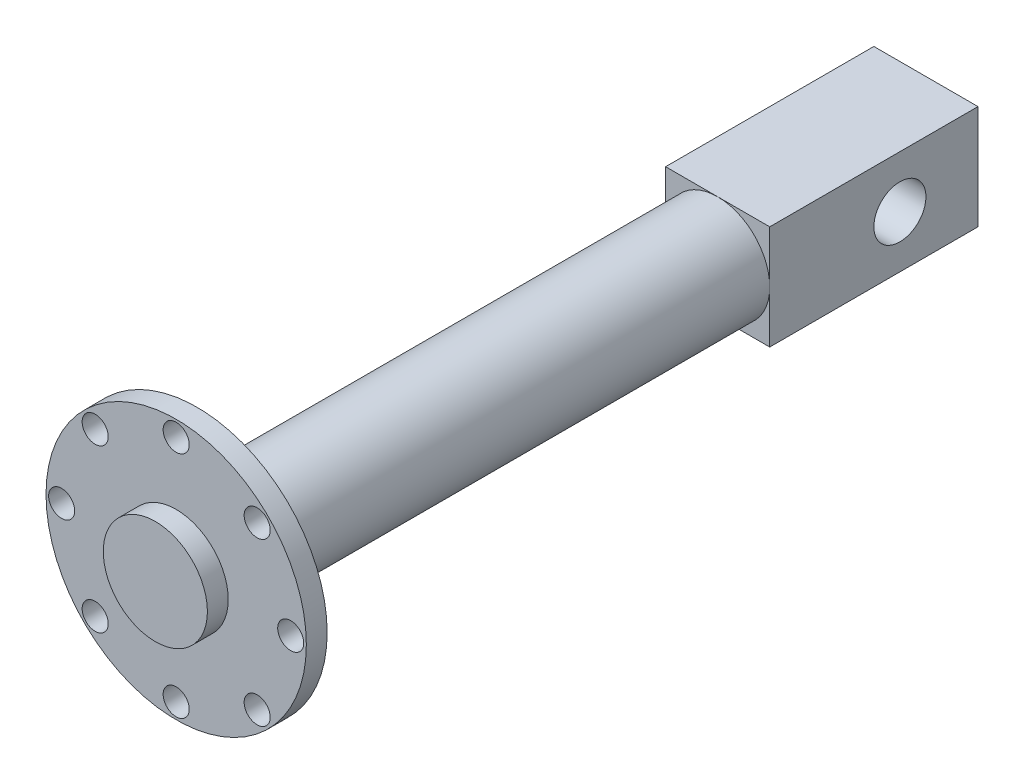
ISO-10303-21;
HEADER;
FILE_DESCRIPTION(('STEP AP214'),'2;1');
FILE_NAME('part.step','',(''),(''),'','','');
FILE_SCHEMA(('AUTOMOTIVE_DESIGN { 1 0 10303 214 1 1 1 1 }'));
ENDSEC;
DATA;
#1=APPLICATION_CONTEXT('core data for automotive mechanical design processes');
#2=APPLICATION_PROTOCOL_DEFINITION('international standard','automotive_design',2000,#1);
#3=PRODUCT_CONTEXT('',#1,'mechanical');
#4=PRODUCT('Part','Part','',(#3));
#5=PRODUCT_RELATED_PRODUCT_CATEGORY('part','',(#4));
#6=PRODUCT_DEFINITION_FORMATION('','',#4);
#7=PRODUCT_DEFINITION_CONTEXT('part definition',#1,'design');
#8=PRODUCT_DEFINITION('design','',#6,#7);
#9=PRODUCT_DEFINITION_SHAPE('','',#8);
#10=(LENGTH_UNIT() NAMED_UNIT(*) SI_UNIT(.MILLI.,.METRE.));
#11=(NAMED_UNIT(*) PLANE_ANGLE_UNIT() SI_UNIT($,.RADIAN.));
#12=(NAMED_UNIT(*) SI_UNIT($,.STERADIAN.) SOLID_ANGLE_UNIT());
#13=UNCERTAINTY_MEASURE_WITH_UNIT(LENGTH_MEASURE(1.E-05),#10,'distance_accuracy_value','');
#14=(GEOMETRIC_REPRESENTATION_CONTEXT(3) GLOBAL_UNCERTAINTY_ASSIGNED_CONTEXT((#13)) GLOBAL_UNIT_ASSIGNED_CONTEXT((#10,
#11,#12)) REPRESENTATION_CONTEXT('',''));
#15=CARTESIAN_POINT('',(0.,0.,0.));
#16=DIRECTION('',(0.,0.,1.));
#17=DIRECTION('',(1.,0.,0.));
#18=AXIS2_PLACEMENT_3D('',#15,#16,#17);
#19=CARTESIAN_POINT('',(0.,0.,20.));
#20=DIRECTION('',(0.,0.,1.));
#21=DIRECTION('',(1.,0.,0.));
#22=AXIS2_PLACEMENT_3D('',#19,#20,#21);
#23=PLANE('',#22);
#24=CARTESIAN_POINT('',(0.,0.,20.));
#25=DIRECTION('',(0.,0.,1.));
#26=DIRECTION('',(1.,0.,0.));
#27=AXIS2_PLACEMENT_3D('',#24,#25,#26);
#28=CIRCLE('',#27,5.);
#29=CARTESIAN_POINT('',(5.,0.,20.));
#30=VERTEX_POINT('',#29);
#31=CARTESIAN_POINT('',(0.,5.,20.));
#32=VERTEX_POINT('',#31);
#33=EDGE_CURVE('E51',#30,#32,#28,.T.);
#34=ORIENTED_EDGE('',*,*,#33,.F.);
#35=DIRECTION('',(0.,1.,0.));
#36=VECTOR('',#35,1.);
#37=CARTESIAN_POINT('',(5.,5.,20.));
#38=LINE('',#37,#36);
#39=CARTESIAN_POINT('',(5.,5.,20.));
#40=VERTEX_POINT('',#39);
#41=EDGE_CURVE('E103',#30,#40,#38,.T.);
#42=ORIENTED_EDGE('',*,*,#41,.T.);
#43=DIRECTION('',(-1.,0.,0.));
#44=VECTOR('',#43,1.);
#45=CARTESIAN_POINT('',(-5.,5.,20.));
#46=LINE('',#45,#44);
#47=EDGE_CURVE('E116',#40,#32,#46,.T.);
#48=ORIENTED_EDGE('',*,*,#47,.T.);
#49=EDGE_LOOP('',(#34,#42,#48));
#50=FACE_BOUND('',#49,.T.);
#51=ADVANCED_FACE('F39',(#50),#23,.T.);
#52=CARTESIAN_POINT('',(-5.,0.,20.));
#53=VERTEX_POINT('',#52);
#54=EDGE_CURVE('E11',#32,#53,#28,.T.);
#55=ORIENTED_EDGE('',*,*,#54,.F.);
#56=CARTESIAN_POINT('',(-5.,5.,20.));
#57=VERTEX_POINT('',#56);
#58=EDGE_CURVE('E102',#32,#57,#46,.T.);
#59=ORIENTED_EDGE('',*,*,#58,.T.);
#60=DIRECTION('',(0.,-1.,0.));
#61=VECTOR('',#60,1.);
#62=CARTESIAN_POINT('',(-5.,5.,20.));
#63=LINE('',#62,#61);
#64=EDGE_CURVE('E138',#57,#53,#63,.T.);
#65=ORIENTED_EDGE('',*,*,#64,.T.);
#66=EDGE_LOOP('',(#55,#59,#65));
#67=FACE_BOUND('',#66,.T.);
#68=ADVANCED_FACE('F294',(#67),#23,.T.);
#69=CARTESIAN_POINT('',(0.,-5.,20.));
#70=VERTEX_POINT('',#69);
#71=EDGE_CURVE('E49',#53,#70,#28,.T.);
#72=ORIENTED_EDGE('',*,*,#71,.F.);
#73=CARTESIAN_POINT('',(-5.,-5.,20.));
#74=VERTEX_POINT('',#73);
#75=EDGE_CURVE('E137',#53,#74,#63,.T.);
#76=ORIENTED_EDGE('',*,*,#75,.T.);
#77=DIRECTION('',(1.,0.,0.));
#78=VECTOR('',#77,1.);
#79=CARTESIAN_POINT('',(-5.,-5.,20.));
#80=LINE('',#79,#78);
#81=EDGE_CURVE('E142',#74,#70,#80,.T.);
#82=ORIENTED_EDGE('',*,*,#81,.T.);
#83=EDGE_LOOP('',(#72,#76,#82));
#84=FACE_BOUND('',#83,.T.);
#85=ADVANCED_FACE('F299',(#84),#23,.T.);
#86=CARTESIAN_POINT('',(5.,5.,20.));
#87=DIRECTION('',(-1.,0.,0.));
#88=DIRECTION('',(0.,-1.,0.));
#89=AXIS2_PLACEMENT_3D('',#86,#87,#88);
#90=PLANE('',#89);
#91=CARTESIAN_POINT('',(5.,0.,7.5));
#92=DIRECTION('',(1.,0.,0.));
#93=DIRECTION('',(0.,1.,0.));
#94=AXIS2_PLACEMENT_3D('',#91,#92,#93);
#95=CIRCLE('',#94,2.5);
#96=CARTESIAN_POINT('',(5.,2.5,7.5));
#97=VERTEX_POINT('',#96);
#98=EDGE_CURVE('E130',#97,#97,#95,.T.);
#99=ORIENTED_EDGE('',*,*,#98,.F.);
#100=EDGE_LOOP('',(#99));
#101=FACE_BOUND('',#100,.T.);
#102=DIRECTION('',(0.,1.,0.));
#103=VECTOR('',#102,1.);
#104=CARTESIAN_POINT('',(5.,5.,0.));
#105=LINE('',#104,#103);
#106=CARTESIAN_POINT('',(5.,-5.,0.));
#107=VERTEX_POINT('',#106);
#108=CARTESIAN_POINT('',(5.,5.,0.));
#109=VERTEX_POINT('',#108);
#110=EDGE_CURVE('E146',#107,#109,#105,.T.);
#111=ORIENTED_EDGE('',*,*,#110,.T.);
#112=DIRECTION('',(0.,0.,-1.));
#113=VECTOR('',#112,1.);
#114=CARTESIAN_POINT('',(5.,5.,20.));
#115=LINE('',#114,#113);
#116=EDGE_CURVE('E109',#40,#109,#115,.T.);
#117=ORIENTED_EDGE('',*,*,#116,.F.);
#118=ORIENTED_EDGE('',*,*,#41,.F.);
#119=CARTESIAN_POINT('',(5.,-5.,20.));
#120=VERTEX_POINT('',#119);
#121=EDGE_CURVE('E94',#120,#30,#38,.T.);
#122=ORIENTED_EDGE('',*,*,#121,.F.);
#123=DIRECTION('',(0.,0.,-1.));
#124=VECTOR('',#123,1.);
#125=CARTESIAN_POINT('',(5.,-5.,20.));
#126=LINE('',#125,#124);
#127=EDGE_CURVE('E145',#120,#107,#126,.T.);
#128=ORIENTED_EDGE('',*,*,#127,.T.);
#129=EDGE_LOOP('',(#111,#117,#118,#122,#128));
#130=FACE_BOUND('',#129,.T.);
#131=ADVANCED_FACE('F41',(#101,#130),#90,.F.);
#132=CARTESIAN_POINT('',(-5.,5.,20.));
#133=DIRECTION('',(0.,-1.,0.));
#134=DIRECTION('',(0.,0.,-1.));
#135=AXIS2_PLACEMENT_3D('',#132,#133,#134);
#136=PLANE('',#135);
#137=DIRECTION('',(-1.,0.,0.));
#138=VECTOR('',#137,1.);
#139=CARTESIAN_POINT('',(-5.,5.,0.));
#140=LINE('',#139,#138);
#141=CARTESIAN_POINT('',(-5.,5.,0.));
#142=VERTEX_POINT('',#141);
#143=EDGE_CURVE('E149',#109,#142,#140,.T.);
#144=ORIENTED_EDGE('',*,*,#143,.T.);
#145=DIRECTION('',(0.,0.,-1.));
#146=VECTOR('',#145,1.);
#147=CARTESIAN_POINT('',(-5.,5.,20.));
#148=LINE('',#147,#146);
#149=EDGE_CURVE('E125',#57,#142,#148,.T.);
#150=ORIENTED_EDGE('',*,*,#149,.F.);
#151=ORIENTED_EDGE('',*,*,#58,.F.);
#152=ORIENTED_EDGE('',*,*,#47,.F.);
#153=ORIENTED_EDGE('',*,*,#116,.T.);
#154=EDGE_LOOP('',(#144,#150,#151,#152,#153));
#155=FACE_BOUND('',#154,.T.);
#156=ADVANCED_FACE('F318',(#155),#136,.F.);
#157=CARTESIAN_POINT('',(-5.,5.,20.));
#158=DIRECTION('',(1.,0.,0.));
#159=DIRECTION('',(0.,0.,-1.));
#160=AXIS2_PLACEMENT_3D('',#157,#158,#159);
#161=PLANE('',#160);
#162=CARTESIAN_POINT('',(-5.,0.,7.5));
#163=DIRECTION('',(1.,0.,0.));
#164=DIRECTION('',(0.,0.,-1.));
#165=AXIS2_PLACEMENT_3D('',#162,#163,#164);
#166=CIRCLE('',#165,2.5);
#167=CARTESIAN_POINT('',(-5.,2.5,7.5));
#168=VERTEX_POINT('',#167);
#169=EDGE_CURVE('E133',#168,#168,#166,.T.);
#170=ORIENTED_EDGE('',*,*,#169,.T.);
#171=EDGE_LOOP('',(#170));
#172=FACE_BOUND('',#171,.T.);
#173=DIRECTION('',(0.,-1.,0.));
#174=VECTOR('',#173,1.);
#175=CARTESIAN_POINT('',(-5.,5.,0.));
#176=LINE('',#175,#174);
#177=CARTESIAN_POINT('',(-5.,-5.,0.));
#178=VERTEX_POINT('',#177);
#179=EDGE_CURVE('E152',#142,#178,#176,.T.);
#180=ORIENTED_EDGE('',*,*,#179,.T.);
#181=DIRECTION('',(0.,0.,-1.));
#182=VECTOR('',#181,1.);
#183=CARTESIAN_POINT('',(-5.,-5.,20.));
#184=LINE('',#183,#182);
#185=EDGE_CURVE('E159',#74,#178,#184,.T.);
#186=ORIENTED_EDGE('',*,*,#185,.F.);
#187=ORIENTED_EDGE('',*,*,#75,.F.);
#188=ORIENTED_EDGE('',*,*,#64,.F.);
#189=ORIENTED_EDGE('',*,*,#149,.T.);
#190=EDGE_LOOP('',(#180,#186,#187,#188,#189));
#191=FACE_BOUND('',#190,.T.);
#192=ADVANCED_FACE('F311',(#172,#191),#161,.F.);
#193=CARTESIAN_POINT('',(-5.,-5.,20.));
#194=DIRECTION('',(0.,1.,0.));
#195=DIRECTION('',(0.,0.,1.));
#196=AXIS2_PLACEMENT_3D('',#193,#194,#195);
#197=PLANE('',#196);
#198=DIRECTION('',(1.,0.,0.));
#199=VECTOR('',#198,1.);
#200=CARTESIAN_POINT('',(-5.,-5.,0.));
#201=LINE('',#200,#199);
#202=EDGE_CURVE('E114',#178,#107,#201,.T.);
#203=ORIENTED_EDGE('',*,*,#202,.T.);
#204=ORIENTED_EDGE('',*,*,#127,.F.);
#205=EDGE_CURVE('E97',#70,#120,#80,.T.);
#206=ORIENTED_EDGE('',*,*,#205,.F.);
#207=ORIENTED_EDGE('',*,*,#81,.F.);
#208=ORIENTED_EDGE('',*,*,#185,.T.);
#209=EDGE_LOOP('',(#203,#204,#206,#207,#208));
#210=FACE_BOUND('',#209,.T.);
#211=ADVANCED_FACE('F305',(#210),#197,.F.);
#212=EDGE_CURVE('E58',#70,#30,#28,.T.);
#213=ORIENTED_EDGE('',*,*,#212,.F.);
#214=ORIENTED_EDGE('',*,*,#205,.T.);
#215=ORIENTED_EDGE('',*,*,#121,.T.);
#216=EDGE_LOOP('',(#213,#214,#215));
#217=FACE_BOUND('',#216,.T.);
#218=ADVANCED_FACE('F96',(#217),#23,.T.);
#219=CARTESIAN_POINT('',(0.,0.,0.));
#220=DIRECTION('',(0.,0.,1.));
#221=DIRECTION('',(1.,0.,0.));
#222=AXIS2_PLACEMENT_3D('',#219,#220,#221);
#223=PLANE('',#222);
#224=ORIENTED_EDGE('',*,*,#110,.F.);
#225=ORIENTED_EDGE('',*,*,#202,.F.);
#226=ORIENTED_EDGE('',*,*,#179,.F.);
#227=ORIENTED_EDGE('',*,*,#143,.F.);
#228=EDGE_LOOP('',(#224,#225,#226,#227));
#229=FACE_BOUND('',#228,.T.);
#230=ADVANCED_FACE('F304',(#229),#223,.F.);
#231=CARTESIAN_POINT('',(-15.,0.,7.5));
#232=DIRECTION('',(1.,0.,0.));
#233=DIRECTION('',(0.,1.,0.));
#234=AXIS2_PLACEMENT_3D('',#231,#232,#233);
#235=CYLINDRICAL_SURFACE('',#234,2.5);
#236=CARTESIAN_POINT('',(5.,2.5,7.5));
#237=CARTESIAN_POINT('',(4.89583333333333,2.5,7.5));
#238=CARTESIAN_POINT('',(4.79166666666667,2.5,7.5));
#239=CARTESIAN_POINT('',(4.58333333333333,2.5,7.5));
#240=CARTESIAN_POINT('',(4.47916666666667,2.5,7.5));
#241=CARTESIAN_POINT('',(4.27083333333333,2.5,7.5));
#242=CARTESIAN_POINT('',(4.16666666666667,2.5,7.5));
#243=CARTESIAN_POINT('',(3.95833333333333,2.5,7.5));
#244=CARTESIAN_POINT('',(3.85416666666667,2.5,7.5));
#245=CARTESIAN_POINT('',(3.64583333333333,2.5,7.5));
#246=CARTESIAN_POINT('',(3.54166666666667,2.5,7.5));
#247=CARTESIAN_POINT('',(3.33333333333333,2.5,7.5));
#248=CARTESIAN_POINT('',(3.22916666666667,2.5,7.5));
#249=CARTESIAN_POINT('',(3.02083333333333,2.5,7.5));
#250=CARTESIAN_POINT('',(2.91666666666667,2.5,7.5));
#251=CARTESIAN_POINT('',(2.70833333333333,2.5,7.5));
#252=CARTESIAN_POINT('',(2.60416666666667,2.5,7.5));
#253=CARTESIAN_POINT('',(2.39583333333333,2.5,7.5));
#254=CARTESIAN_POINT('',(2.29166666666667,2.5,7.5));
#255=CARTESIAN_POINT('',(2.08333333333333,2.5,7.5));
#256=CARTESIAN_POINT('',(1.97916666666667,2.5,7.5));
#257=CARTESIAN_POINT('',(1.77083333333333,2.5,7.5));
#258=CARTESIAN_POINT('',(1.66666666666666,2.5,7.5));
#259=CARTESIAN_POINT('',(1.45833333333333,2.5,7.5));
#260=CARTESIAN_POINT('',(1.35416666666666,2.5,7.5));
#261=CARTESIAN_POINT('',(1.14583333333333,2.5,7.5));
#262=CARTESIAN_POINT('',(1.04166666666666,2.5,7.5));
#263=CARTESIAN_POINT('',(0.833333333333331,2.5,7.5));
#264=CARTESIAN_POINT('',(0.729166666666664,2.5,7.5));
#265=CARTESIAN_POINT('',(0.520833333333331,2.5,7.5));
#266=CARTESIAN_POINT('',(0.416666666666666,2.5,7.5));
#267=CARTESIAN_POINT('',(0.208333333333334,2.5,7.5));
#268=CARTESIAN_POINT('',(0.104166666666667,2.5,7.5));
#269=CARTESIAN_POINT('',(-0.104166666666667,2.5,7.5));
#270=CARTESIAN_POINT('',(-0.208333333333334,2.5,7.5));
#271=CARTESIAN_POINT('',(-0.416666666666667,2.5,7.5));
#272=CARTESIAN_POINT('',(-0.520833333333334,2.5,7.5));
#273=CARTESIAN_POINT('',(-0.729166666666667,2.5,7.5));
#274=CARTESIAN_POINT('',(-0.833333333333334,2.5,7.5));
#275=CARTESIAN_POINT('',(-1.04166666666667,2.5,7.5));
#276=CARTESIAN_POINT('',(-1.14583333333333,2.5,7.5));
#277=CARTESIAN_POINT('',(-1.35416666666667,2.5,7.5));
#278=CARTESIAN_POINT('',(-1.45833333333333,2.5,7.5));
#279=CARTESIAN_POINT('',(-1.66666666666667,2.5,7.5));
#280=CARTESIAN_POINT('',(-1.77083333333333,2.5,7.5));
#281=CARTESIAN_POINT('',(-1.97916666666667,2.5,7.5));
#282=CARTESIAN_POINT('',(-2.08333333333333,2.5,7.5));
#283=CARTESIAN_POINT('',(-2.29166666666667,2.5,7.5));
#284=CARTESIAN_POINT('',(-2.39583333333333,2.5,7.5));
#285=CARTESIAN_POINT('',(-2.60416666666667,2.5,7.5));
#286=CARTESIAN_POINT('',(-2.70833333333333,2.5,7.5));
#287=CARTESIAN_POINT('',(-2.91666666666667,2.5,7.5));
#288=CARTESIAN_POINT('',(-3.02083333333333,2.5,7.5));
#289=CARTESIAN_POINT('',(-3.22916666666667,2.5,7.5));
#290=CARTESIAN_POINT('',(-3.33333333333333,2.5,7.5));
#291=CARTESIAN_POINT('',(-3.54166666666667,2.5,7.5));
#292=CARTESIAN_POINT('',(-3.64583333333333,2.5,7.5));
#293=CARTESIAN_POINT('',(-3.85416666666667,2.5,7.5));
#294=CARTESIAN_POINT('',(-3.95833333333334,2.5,7.5));
#295=CARTESIAN_POINT('',(-4.16666666666667,2.5,7.5));
#296=CARTESIAN_POINT('',(-4.27083333333334,2.5,7.5));
#297=CARTESIAN_POINT('',(-4.47916666666667,2.5,7.5));
#298=CARTESIAN_POINT('',(-4.58333333333334,2.5,7.5));
#299=CARTESIAN_POINT('',(-4.79166666666667,2.5,7.5));
#300=CARTESIAN_POINT('',(-4.89583333333334,2.5,7.5));
#301=CARTESIAN_POINT('',(-5.,2.5,7.5));
#302=B_SPLINE_CURVE_WITH_KNOTS('',3,(#236,#237,#238,#239,#240,#241,#242,#243,#244,#245,#246,
#247,#248,#249,#250,#251,#252,#253,#254,#255,#256,#257,#258,#259,#260,#261,#262,#263,#264,#265,
#266,#267,#268,#269,#270,#271,#272,#273,#274,#275,#276,#277,#278,#279,#280,#281,#282,#283,#284,
#285,#286,#287,#288,#289,#290,#291,#292,#293,#294,#295,#296,#297,#298,#299,#300,#301),
.UNSPECIFIED.,.F.,.F.,(4,2,2,2,2,2,2,2,2,2,2,2,2,2,2,2,2,2,2,2,2,2,2,2,2,2,2,2,2,2,2,2,4),(0.,
0.3125,0.625000000000001,0.937500000000001,1.25,1.5625,1.875,2.1875,2.5,2.8125,3.125,3.4375,
3.75,4.0625,4.375,4.6875,5.,5.3125,5.625,5.9375,6.25,6.5625,6.875,7.1875,7.5,7.8125,8.125,
8.4375,8.75,9.0625,9.375,9.6875,10.),.UNSPECIFIED.);
#303=EDGE_CURVE('BSEAM289',#97,#168,#302,.T.);
#304=ORIENTED_EDGE('',*,*,#98,.T.);
#305=ORIENTED_EDGE('',*,*,#169,.F.);
#306=ORIENTED_EDGE('',*,*,#303,.T.);
#307=ORIENTED_EDGE('',*,*,#303,.F.);
#308=EDGE_LOOP('',(#304,#306,#305,#307));
#309=FACE_BOUND('',#308,.T.);
#310=ADVANCED_FACE('F289',(#309),#235,.F.);
#311=CARTESIAN_POINT('',(0.,0.,70.));
#312=DIRECTION('',(0.,0.,-1.));
#313=DIRECTION('',(-1.,0.,0.));
#314=AXIS2_PLACEMENT_3D('',#311,#312,#313);
#315=CYLINDRICAL_SURFACE('',#314,5.);
#316=CARTESIAN_POINT('',(0.,0.,70.));
#317=DIRECTION('',(0.,0.,1.));
#318=DIRECTION('',(1.,0.,0.));
#319=AXIS2_PLACEMENT_3D('',#316,#317,#318);
#320=CIRCLE('',#319,5.);
#321=CARTESIAN_POINT('',(5.,0.,70.));
#322=VERTEX_POINT('',#321);
#323=EDGE_CURVE('E119',#322,#322,#320,.T.);
#324=ORIENTED_EDGE('',*,*,#323,.F.);
#325=EDGE_LOOP('',(#324));
#326=FACE_BOUND('',#325,.T.);
#327=ORIENTED_EDGE('',*,*,#33,.T.);
#328=ORIENTED_EDGE('',*,*,#54,.T.);
#329=ORIENTED_EDGE('',*,*,#71,.T.);
#330=ORIENTED_EDGE('',*,*,#212,.T.);
#331=EDGE_LOOP('',(#327,#328,#329,#330));
#332=FACE_BOUND('',#331,.T.);
#333=ADVANCED_FACE('F121',(#326,#332),#315,.T.);
#334=CARTESIAN_POINT('',(0.,0.,72.));
#335=DIRECTION('',(0.,0.,-1.));
#336=DIRECTION('',(-1.,0.,0.));
#337=AXIS2_PLACEMENT_3D('',#334,#335,#336);
#338=CYLINDRICAL_SURFACE('',#337,12.5);
#339=CARTESIAN_POINT('',(0.,0.,72.));
#340=DIRECTION('',(0.,0.,1.));
#341=DIRECTION('',(1.,0.,0.));
#342=AXIS2_PLACEMENT_3D('',#339,#340,#341);
#343=CIRCLE('',#342,12.5);
#344=CARTESIAN_POINT('',(12.5,0.,72.));
#345=VERTEX_POINT('',#344);
#346=EDGE_CURVE('E120',#345,#345,#343,.T.);
#347=ORIENTED_EDGE('',*,*,#346,.F.);
#348=EDGE_LOOP('',(#347));
#349=FACE_BOUND('',#348,.T.);
#350=CARTESIAN_POINT('',(0.,0.,70.));
#351=DIRECTION('',(0.,0.,1.));
#352=DIRECTION('',(1.,0.,0.));
#353=AXIS2_PLACEMENT_3D('',#350,#351,#352);
#354=CIRCLE('',#353,12.5);
#355=CARTESIAN_POINT('',(12.5,0.,70.));
#356=VERTEX_POINT('',#355);
#357=EDGE_CURVE('E200',#356,#356,#354,.T.);
#358=ORIENTED_EDGE('',*,*,#357,.T.);
#359=EDGE_LOOP('',(#358));
#360=FACE_BOUND('',#359,.T.);
#361=ADVANCED_FACE('F264',(#349,#360),#338,.T.);
#362=CARTESIAN_POINT('',(0.,0.,72.));
#363=DIRECTION('',(0.,0.,1.));
#364=DIRECTION('',(1.,0.,0.));
#365=AXIS2_PLACEMENT_3D('',#362,#363,#364);
#366=PLANE('',#365);
#367=CARTESIAN_POINT('',(0.,0.,72.));
#368=DIRECTION('',(0.,0.,1.));
#369=DIRECTION('',(1.,0.,0.));
#370=AXIS2_PLACEMENT_3D('',#367,#368,#369);
#371=CIRCLE('',#370,5.);
#372=CARTESIAN_POINT('',(5.,0.,72.));
#373=VERTEX_POINT('',#372);
#374=EDGE_CURVE('E243',#373,#373,#371,.T.);
#375=ORIENTED_EDGE('',*,*,#374,.F.);
#376=EDGE_LOOP('',(#375));
#377=FACE_BOUND('',#376,.T.);
#378=CARTESIAN_POINT('',(0.,11.,72.));
#379=DIRECTION('',(0.,0.,1.));
#380=DIRECTION('',(1.,0.,0.));
#381=AXIS2_PLACEMENT_3D('',#378,#379,#380);
#382=CIRCLE('',#381,1.25);
#383=CARTESIAN_POINT('',(1.25,11.,72.));
#384=VERTEX_POINT('',#383);
#385=EDGE_CURVE('E174',#384,#384,#382,.T.);
#386=ORIENTED_EDGE('',*,*,#385,.F.);
#387=EDGE_LOOP('',(#386));
#388=FACE_BOUND('',#387,.T.);
#389=CARTESIAN_POINT('',(7.77817459305216,7.77817459305236,72.));
#390=DIRECTION('',(0.,0.,1.));
#391=DIRECTION('',(1.,0.,0.));
#392=AXIS2_PLACEMENT_3D('',#389,#390,#391);
#393=CIRCLE('',#392,1.25);
#394=CARTESIAN_POINT('',(9.02817459305216,7.77817459305236,72.));
#395=VERTEX_POINT('',#394);
#396=EDGE_CURVE('E236',#395,#395,#393,.T.);
#397=ORIENTED_EDGE('',*,*,#396,.F.);
#398=EDGE_LOOP('',(#397));
#399=FACE_BOUND('',#398,.T.);
#400=CARTESIAN_POINT('',(11.0000000000005,4.78223310904037E-13,72.));
#401=DIRECTION('',(0.,0.,1.));
#402=DIRECTION('',(1.,0.,0.));
#403=AXIS2_PLACEMENT_3D('',#400,#401,#402);
#404=CIRCLE('',#403,1.25);
#405=CARTESIAN_POINT('',(12.2500000000005,4.78223310904037E-13,72.));
#406=VERTEX_POINT('',#405);
#407=EDGE_CURVE('E232',#406,#406,#404,.T.);
#408=ORIENTED_EDGE('',*,*,#407,.F.);
#409=EDGE_LOOP('',(#408));
#410=FACE_BOUND('',#409,.T.);
#411=CARTESIAN_POINT('',(7.77817459305284,-7.77817459305169,72.));
#412=DIRECTION('',(0.,0.,1.));
#413=DIRECTION('',(1.,0.,0.));
#414=AXIS2_PLACEMENT_3D('',#411,#412,#413);
#415=CIRCLE('',#414,1.25);
#416=CARTESIAN_POINT('',(9.02817459305284,-7.77817459305169,72.));
#417=VERTEX_POINT('',#416);
#418=EDGE_CURVE('E228',#417,#417,#415,.T.);
#419=ORIENTED_EDGE('',*,*,#418,.F.);
#420=EDGE_LOOP('',(#419));
#421=FACE_BOUND('',#420,.T.);
#422=CARTESIAN_POINT('',(9.56446621808075E-13,-11.,72.));
#423=DIRECTION('',(0.,0.,1.));
#424=DIRECTION('',(1.,0.,0.));
#425=AXIS2_PLACEMENT_3D('',#422,#423,#424);
#426=CIRCLE('',#425,1.25);
#427=CARTESIAN_POINT('',(1.25000000000096,-11.,72.));
#428=VERTEX_POINT('',#427);
#429=EDGE_CURVE('E224',#428,#428,#426,.T.);
#430=ORIENTED_EDGE('',*,*,#429,.F.);
#431=EDGE_LOOP('',(#430));
#432=FACE_BOUND('',#431,.T.);
#433=CARTESIAN_POINT('',(-7.77817459305121,-7.77817459305236,72.));
#434=DIRECTION('',(0.,0.,1.));
#435=DIRECTION('',(1.,0.,0.));
#436=AXIS2_PLACEMENT_3D('',#433,#434,#435);
#437=CIRCLE('',#436,1.25);
#438=CARTESIAN_POINT('',(-6.52817459305121,-7.77817459305236,72.));
#439=VERTEX_POINT('',#438);
#440=EDGE_CURVE('E220',#439,#439,#437,.T.);
#441=ORIENTED_EDGE('',*,*,#440,.F.);
#442=EDGE_LOOP('',(#441));
#443=FACE_BOUND('',#442,.T.);
#444=CARTESIAN_POINT('',(-10.9999999999995,-4.795704223831E-13,72.));
#445=DIRECTION('',(0.,0.,1.));
#446=DIRECTION('',(1.,0.,0.));
#447=AXIS2_PLACEMENT_3D('',#444,#445,#446);
#448=CIRCLE('',#447,1.25);
#449=CARTESIAN_POINT('',(-9.74999999999952,-4.795704223831E-13,72.));
#450=VERTEX_POINT('',#449);
#451=EDGE_CURVE('E215',#450,#450,#448,.T.);
#452=ORIENTED_EDGE('',*,*,#451,.F.);
#453=EDGE_LOOP('',(#452));
#454=FACE_BOUND('',#453,.T.);
#455=CARTESIAN_POINT('',(-7.77817459305188,7.77817459305168,72.));
#456=DIRECTION('',(0.,0.,1.));
#457=DIRECTION('',(1.,0.,0.));
#458=AXIS2_PLACEMENT_3D('',#455,#456,#457);
#459=CIRCLE('',#458,1.25);
#460=CARTESIAN_POINT('',(-6.52817459305188,7.77817459305168,72.));
#461=VERTEX_POINT('',#460);
#462=EDGE_CURVE('E211',#461,#461,#459,.T.);
#463=ORIENTED_EDGE('',*,*,#462,.F.);
#464=EDGE_LOOP('',(#463));
#465=FACE_BOUND('',#464,.T.);
#466=ORIENTED_EDGE('',*,*,#346,.T.);
#467=EDGE_LOOP('',(#466));
#468=FACE_BOUND('',#467,.T.);
#469=ADVANCED_FACE('F260',(#377,#388,#399,#410,#421,#432,#443,#454,#465,#468),#366,.T.);
#470=CARTESIAN_POINT('',(0.,0.,70.));
#471=DIRECTION('',(0.,0.,1.));
#472=DIRECTION('',(1.,0.,0.));
#473=AXIS2_PLACEMENT_3D('',#470,#471,#472);
#474=PLANE('',#473);
#475=CARTESIAN_POINT('',(0.,11.,70.));
#476=DIRECTION('',(0.,0.,1.));
#477=DIRECTION('',(1.,0.,0.));
#478=AXIS2_PLACEMENT_3D('',#475,#476,#477);
#479=CIRCLE('',#478,1.25);
#480=CARTESIAN_POINT('',(1.25,11.,70.));
#481=VERTEX_POINT('',#480);
#482=EDGE_CURVE('E43',#481,#481,#479,.T.);
#483=ORIENTED_EDGE('',*,*,#482,.T.);
#484=EDGE_LOOP('',(#483));
#485=FACE_BOUND('',#484,.T.);
#486=CARTESIAN_POINT('',(7.77817459305216,7.77817459305236,70.));
#487=DIRECTION('',(0.,0.,1.));
#488=DIRECTION('',(1.,0.,0.));
#489=AXIS2_PLACEMENT_3D('',#486,#487,#488);
#490=CIRCLE('',#489,1.25);
#491=CARTESIAN_POINT('',(9.02817459305216,7.77817459305236,70.));
#492=VERTEX_POINT('',#491);
#493=EDGE_CURVE('E193',#492,#492,#490,.T.);
#494=ORIENTED_EDGE('',*,*,#493,.T.);
#495=EDGE_LOOP('',(#494));
#496=FACE_BOUND('',#495,.T.);
#497=CARTESIAN_POINT('',(11.0000000000005,4.78223310904037E-13,70.));
#498=DIRECTION('',(0.,0.,1.));
#499=DIRECTION('',(1.,0.,0.));
#500=AXIS2_PLACEMENT_3D('',#497,#498,#499);
#501=CIRCLE('',#500,1.25);
#502=CARTESIAN_POINT('',(12.2500000000005,4.78223310904037E-13,70.));
#503=VERTEX_POINT('',#502);
#504=EDGE_CURVE('E190',#503,#503,#501,.T.);
#505=ORIENTED_EDGE('',*,*,#504,.T.);
#506=EDGE_LOOP('',(#505));
#507=FACE_BOUND('',#506,.T.);
#508=CARTESIAN_POINT('',(7.77817459305284,-7.77817459305169,70.));
#509=DIRECTION('',(0.,0.,1.));
#510=DIRECTION('',(1.,0.,0.));
#511=AXIS2_PLACEMENT_3D('',#508,#509,#510);
#512=CIRCLE('',#511,1.25);
#513=CARTESIAN_POINT('',(9.02817459305284,-7.77817459305169,70.));
#514=VERTEX_POINT('',#513);
#515=EDGE_CURVE('E186',#514,#514,#512,.T.);
#516=ORIENTED_EDGE('',*,*,#515,.T.);
#517=EDGE_LOOP('',(#516));
#518=FACE_BOUND('',#517,.T.);
#519=CARTESIAN_POINT('',(9.56446621808075E-13,-11.,70.));
#520=DIRECTION('',(0.,0.,1.));
#521=DIRECTION('',(1.,0.,0.));
#522=AXIS2_PLACEMENT_3D('',#519,#520,#521);
#523=CIRCLE('',#522,1.25);
#524=CARTESIAN_POINT('',(1.25000000000096,-11.,70.));
#525=VERTEX_POINT('',#524);
#526=EDGE_CURVE('E182',#525,#525,#523,.T.);
#527=ORIENTED_EDGE('',*,*,#526,.T.);
#528=EDGE_LOOP('',(#527));
#529=FACE_BOUND('',#528,.T.);
#530=CARTESIAN_POINT('',(-7.77817459305121,-7.77817459305236,70.));
#531=DIRECTION('',(0.,0.,1.));
#532=DIRECTION('',(1.,0.,0.));
#533=AXIS2_PLACEMENT_3D('',#530,#531,#532);
#534=CIRCLE('',#533,1.25);
#535=CARTESIAN_POINT('',(-6.52817459305121,-7.77817459305236,70.));
#536=VERTEX_POINT('',#535);
#537=EDGE_CURVE('E178',#536,#536,#534,.T.);
#538=ORIENTED_EDGE('',*,*,#537,.T.);
#539=EDGE_LOOP('',(#538));
#540=FACE_BOUND('',#539,.T.);
#541=CARTESIAN_POINT('',(-10.9999999999995,-4.795704223831E-13,70.));
#542=DIRECTION('',(0.,0.,1.));
#543=DIRECTION('',(1.,0.,0.));
#544=AXIS2_PLACEMENT_3D('',#541,#542,#543);
#545=CIRCLE('',#544,1.25);
#546=CARTESIAN_POINT('',(-9.74999999999952,-4.795704223831E-13,70.));
#547=VERTEX_POINT('',#546);
#548=EDGE_CURVE('E173',#547,#547,#545,.T.);
#549=ORIENTED_EDGE('',*,*,#548,.T.);
#550=EDGE_LOOP('',(#549));
#551=FACE_BOUND('',#550,.T.);
#552=CARTESIAN_POINT('',(-7.77817459305188,7.77817459305168,70.));
#553=DIRECTION('',(0.,0.,1.));
#554=DIRECTION('',(1.,0.,0.));
#555=AXIS2_PLACEMENT_3D('',#552,#553,#554);
#556=CIRCLE('',#555,1.25);
#557=CARTESIAN_POINT('',(-6.52817459305188,7.77817459305168,70.));
#558=VERTEX_POINT('',#557);
#559=EDGE_CURVE('E169',#558,#558,#556,.T.);
#560=ORIENTED_EDGE('',*,*,#559,.T.);
#561=EDGE_LOOP('',(#560));
#562=FACE_BOUND('',#561,.T.);
#563=ORIENTED_EDGE('',*,*,#323,.T.);
#564=EDGE_LOOP('',(#563));
#565=FACE_BOUND('',#564,.T.);
#566=ORIENTED_EDGE('',*,*,#357,.F.);
#567=EDGE_LOOP('',(#566));
#568=FACE_BOUND('',#567,.T.);
#569=ADVANCED_FACE('F263',(#485,#496,#507,#518,#529,#540,#551,#562,#565,#568),#474,.F.);
#570=CARTESIAN_POINT('',(-7.77817459305188,7.77817459305168,67.));
#571=DIRECTION('',(0.,0.,1.));
#572=DIRECTION('',(1.,0.,0.));
#573=AXIS2_PLACEMENT_3D('',#570,#571,#572);
#574=CYLINDRICAL_SURFACE('',#573,1.25);
#575=ORIENTED_EDGE('',*,*,#462,.T.);
#576=EDGE_LOOP('',(#575));
#577=FACE_BOUND('',#576,.T.);
#578=ORIENTED_EDGE('',*,*,#559,.F.);
#579=EDGE_LOOP('',(#578));
#580=FACE_BOUND('',#579,.T.);
#581=ADVANCED_FACE('F349',(#577,#580),#574,.F.);
#582=CARTESIAN_POINT('',(-10.9999999999995,-4.795704223831E-13,67.));
#583=DIRECTION('',(0.,0.,1.));
#584=DIRECTION('',(1.,0.,0.));
#585=AXIS2_PLACEMENT_3D('',#582,#583,#584);
#586=CYLINDRICAL_SURFACE('',#585,1.25);
#587=ORIENTED_EDGE('',*,*,#451,.T.);
#588=EDGE_LOOP('',(#587));
#589=FACE_BOUND('',#588,.T.);
#590=ORIENTED_EDGE('',*,*,#548,.F.);
#591=EDGE_LOOP('',(#590));
#592=FACE_BOUND('',#591,.T.);
#593=ADVANCED_FACE('F353',(#589,#592),#586,.F.);
#594=CARTESIAN_POINT('',(-7.77817459305121,-7.77817459305236,67.));
#595=DIRECTION('',(0.,0.,1.));
#596=DIRECTION('',(1.,0.,0.));
#597=AXIS2_PLACEMENT_3D('',#594,#595,#596);
#598=CYLINDRICAL_SURFACE('',#597,1.25);
#599=ORIENTED_EDGE('',*,*,#440,.T.);
#600=EDGE_LOOP('',(#599));
#601=FACE_BOUND('',#600,.T.);
#602=ORIENTED_EDGE('',*,*,#537,.F.);
#603=EDGE_LOOP('',(#602));
#604=FACE_BOUND('',#603,.T.);
#605=ADVANCED_FACE('F359',(#601,#604),#598,.F.);
#606=CARTESIAN_POINT('',(9.56446621808075E-13,-11.,67.));
#607=DIRECTION('',(0.,0.,1.));
#608=DIRECTION('',(1.,0.,0.));
#609=AXIS2_PLACEMENT_3D('',#606,#607,#608);
#610=CYLINDRICAL_SURFACE('',#609,1.25);
#611=ORIENTED_EDGE('',*,*,#429,.T.);
#612=EDGE_LOOP('',(#611));
#613=FACE_BOUND('',#612,.T.);
#614=ORIENTED_EDGE('',*,*,#526,.F.);
#615=EDGE_LOOP('',(#614));
#616=FACE_BOUND('',#615,.T.);
#617=ADVANCED_FACE('F363',(#613,#616),#610,.F.);
#618=CARTESIAN_POINT('',(7.77817459305284,-7.77817459305169,67.));
#619=DIRECTION('',(0.,0.,1.));
#620=DIRECTION('',(1.,0.,0.));
#621=AXIS2_PLACEMENT_3D('',#618,#619,#620);
#622=CYLINDRICAL_SURFACE('',#621,1.25);
#623=ORIENTED_EDGE('',*,*,#418,.T.);
#624=EDGE_LOOP('',(#623));
#625=FACE_BOUND('',#624,.T.);
#626=ORIENTED_EDGE('',*,*,#515,.F.);
#627=EDGE_LOOP('',(#626));
#628=FACE_BOUND('',#627,.T.);
#629=ADVANCED_FACE('F367',(#625,#628),#622,.F.);
#630=CARTESIAN_POINT('',(11.0000000000005,4.78223310904037E-13,67.));
#631=DIRECTION('',(0.,0.,1.));
#632=DIRECTION('',(1.,0.,0.));
#633=AXIS2_PLACEMENT_3D('',#630,#631,#632);
#634=CYLINDRICAL_SURFACE('',#633,1.25);
#635=ORIENTED_EDGE('',*,*,#407,.T.);
#636=EDGE_LOOP('',(#635));
#637=FACE_BOUND('',#636,.T.);
#638=ORIENTED_EDGE('',*,*,#504,.F.);
#639=EDGE_LOOP('',(#638));
#640=FACE_BOUND('',#639,.T.);
#641=ADVANCED_FACE('F371',(#637,#640),#634,.F.);
#642=CARTESIAN_POINT('',(7.77817459305216,7.77817459305236,67.));
#643=DIRECTION('',(0.,0.,1.));
#644=DIRECTION('',(1.,0.,0.));
#645=AXIS2_PLACEMENT_3D('',#642,#643,#644);
#646=CYLINDRICAL_SURFACE('',#645,1.25);
#647=ORIENTED_EDGE('',*,*,#396,.T.);
#648=EDGE_LOOP('',(#647));
#649=FACE_BOUND('',#648,.T.);
#650=ORIENTED_EDGE('',*,*,#493,.F.);
#651=EDGE_LOOP('',(#650));
#652=FACE_BOUND('',#651,.T.);
#653=ADVANCED_FACE('F375',(#649,#652),#646,.F.);
#654=CARTESIAN_POINT('',(0.,11.,67.));
#655=DIRECTION('',(0.,0.,1.));
#656=DIRECTION('',(1.,0.,0.));
#657=AXIS2_PLACEMENT_3D('',#654,#655,#656);
#658=CYLINDRICAL_SURFACE('',#657,1.25);
#659=ORIENTED_EDGE('',*,*,#385,.T.);
#660=EDGE_LOOP('',(#659));
#661=FACE_BOUND('',#660,.T.);
#662=ORIENTED_EDGE('',*,*,#482,.F.);
#663=EDGE_LOOP('',(#662));
#664=FACE_BOUND('',#663,.T.);
#665=ADVANCED_FACE('F256',(#661,#664),#658,.F.);
#666=CARTESIAN_POINT('',(0.,0.,74.));
#667=DIRECTION('',(0.,0.,-1.));
#668=DIRECTION('',(-1.,0.,0.));
#669=AXIS2_PLACEMENT_3D('',#666,#667,#668);
#670=CYLINDRICAL_SURFACE('',#669,5.);
#671=CARTESIAN_POINT('',(0.,0.,74.));
#672=DIRECTION('',(0.,0.,1.));
#673=DIRECTION('',(1.,0.,0.));
#674=AXIS2_PLACEMENT_3D('',#671,#672,#673);
#675=CIRCLE('',#674,5.);
#676=CARTESIAN_POINT('',(5.,0.,74.));
#677=VERTEX_POINT('',#676);
#678=EDGE_CURVE('E216',#677,#677,#675,.T.);
#679=ORIENTED_EDGE('',*,*,#678,.F.);
#680=EDGE_LOOP('',(#679));
#681=FACE_BOUND('',#680,.T.);
#682=ORIENTED_EDGE('',*,*,#374,.T.);
#683=EDGE_LOOP('',(#682));
#684=FACE_BOUND('',#683,.T.);
#685=ADVANCED_FACE('F253',(#681,#684),#670,.T.);
#686=CARTESIAN_POINT('',(0.,0.,74.));
#687=DIRECTION('',(0.,0.,1.));
#688=DIRECTION('',(1.,0.,0.));
#689=AXIS2_PLACEMENT_3D('',#686,#687,#688);
#690=PLANE('',#689);
#691=ORIENTED_EDGE('',*,*,#678,.T.);
#692=EDGE_LOOP('',(#691));
#693=FACE_BOUND('',#692,.T.);
#694=ADVANCED_FACE('F251',(#693),#690,.T.);
#695=CLOSED_SHELL('',(#51,#68,#85,#131,#156,#192,#211,#218,#230,#310,#333,#361,#469,#569,#581,
#593,#605,#617,#629,#641,#653,#665,#685,#694));
#696=MANIFOLD_SOLID_BREP('B2',#695);
#697=ADVANCED_BREP_SHAPE_REPRESENTATION('',(#18,#696),#14);
#698=SHAPE_DEFINITION_REPRESENTATION(#9,#697);
ENDSEC;
END-ISO-10303-21;
